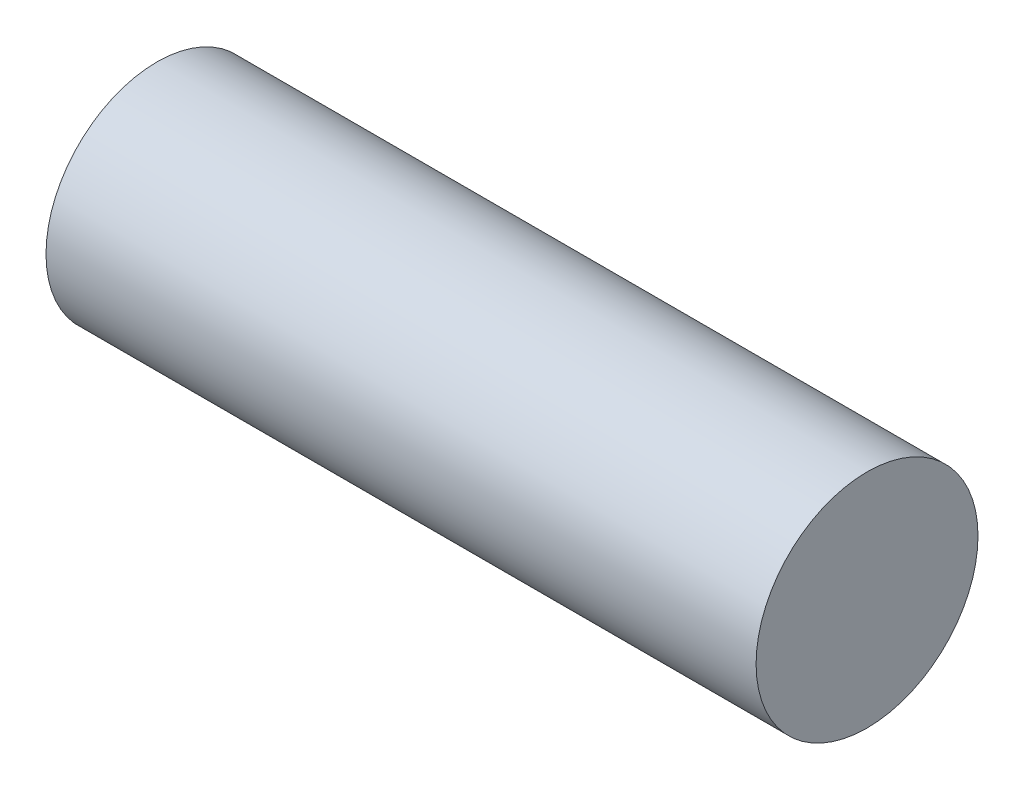
ISO-10303-21;
HEADER;
FILE_DESCRIPTION(('STEP AP214'),'2;1');
FILE_NAME('part.step','',(''),(''),'','','');
FILE_SCHEMA(('AUTOMOTIVE_DESIGN { 1 0 10303 214 1 1 1 1 }'));
ENDSEC;
DATA;
#1=APPLICATION_CONTEXT('core data for automotive mechanical design processes');
#2=APPLICATION_PROTOCOL_DEFINITION('international standard','automotive_design',2000,#1);
#3=PRODUCT_CONTEXT('',#1,'mechanical');
#4=PRODUCT('Part','Part','',(#3));
#5=PRODUCT_RELATED_PRODUCT_CATEGORY('part','',(#4));
#6=PRODUCT_DEFINITION_FORMATION('','',#4);
#7=PRODUCT_DEFINITION_CONTEXT('part definition',#1,'design');
#8=PRODUCT_DEFINITION('design','',#6,#7);
#9=PRODUCT_DEFINITION_SHAPE('','',#8);
#10=(LENGTH_UNIT() NAMED_UNIT(*) SI_UNIT(.MILLI.,.METRE.));
#11=(NAMED_UNIT(*) PLANE_ANGLE_UNIT() SI_UNIT($,.RADIAN.));
#12=(NAMED_UNIT(*) SI_UNIT($,.STERADIAN.) SOLID_ANGLE_UNIT());
#13=UNCERTAINTY_MEASURE_WITH_UNIT(LENGTH_MEASURE(1.E-05),#10,'distance_accuracy_value','');
#14=(GEOMETRIC_REPRESENTATION_CONTEXT(3) GLOBAL_UNCERTAINTY_ASSIGNED_CONTEXT((#13)) GLOBAL_UNIT_ASSIGNED_CONTEXT((#10,
#11,#12)) REPRESENTATION_CONTEXT('',''));
#15=CARTESIAN_POINT('',(0.,0.,0.));
#16=DIRECTION('',(0.,0.,1.));
#17=DIRECTION('',(1.,0.,0.));
#18=AXIS2_PLACEMENT_3D('',#15,#16,#17);
#19=CARTESIAN_POINT('',(16.,0.,0.));
#20=DIRECTION('',(-1.,0.,0.));
#21=DIRECTION('',(0.,0.,1.));
#22=AXIS2_PLACEMENT_3D('',#19,#20,#21);
#23=CYLINDRICAL_SURFACE('',#22,2.5);
#24=CARTESIAN_POINT('',(16.,0.,0.));
#25=DIRECTION('',(1.,0.,0.));
#26=DIRECTION('',(0.,0.,-1.));
#27=AXIS2_PLACEMENT_3D('',#24,#25,#26);
#28=CIRCLE('',#27,2.5);
#29=CARTESIAN_POINT('',(16.,0.,-2.5));
#30=VERTEX_POINT('',#29);
#31=EDGE_CURVE('E10',#30,#30,#28,.T.);
#32=ORIENTED_EDGE('',*,*,#31,.F.);
#33=EDGE_LOOP('',(#32));
#34=FACE_BOUND('',#33,.T.);
#35=CARTESIAN_POINT('',(0.,0.,0.));
#36=DIRECTION('',(1.,0.,0.));
#37=DIRECTION('',(0.,0.,-1.));
#38=AXIS2_PLACEMENT_3D('',#35,#36,#37);
#39=CIRCLE('',#38,2.5);
#40=CARTESIAN_POINT('',(0.,0.,-2.5));
#41=VERTEX_POINT('',#40);
#42=EDGE_CURVE('E40',#41,#41,#39,.T.);
#43=ORIENTED_EDGE('',*,*,#42,.T.);
#44=EDGE_LOOP('',(#43));
#45=FACE_BOUND('',#44,.T.);
#46=ADVANCED_FACE('F37',(#34,#45),#23,.T.);
#47=CARTESIAN_POINT('',(16.,0.,0.));
#48=DIRECTION('',(1.,0.,0.));
#49=DIRECTION('',(0.,0.,-1.));
#50=AXIS2_PLACEMENT_3D('',#47,#48,#49);
#51=PLANE('',#50);
#52=ORIENTED_EDGE('',*,*,#31,.T.);
#53=EDGE_LOOP('',(#52));
#54=FACE_BOUND('',#53,.T.);
#55=ADVANCED_FACE('F52',(#54),#51,.T.);
#56=CARTESIAN_POINT('',(0.,0.,0.));
#57=DIRECTION('',(1.,0.,0.));
#58=DIRECTION('',(0.,0.,-1.));
#59=AXIS2_PLACEMENT_3D('',#56,#57,#58);
#60=PLANE('',#59);
#61=ORIENTED_EDGE('',*,*,#42,.F.);
#62=EDGE_LOOP('',(#61));
#63=FACE_BOUND('',#62,.T.);
#64=ADVANCED_FACE('F50',(#63),#60,.F.);
#65=CLOSED_SHELL('',(#46,#55,#64));
#66=MANIFOLD_SOLID_BREP('B2',#65);
#67=ADVANCED_BREP_SHAPE_REPRESENTATION('',(#18,#66),#14);
#68=SHAPE_DEFINITION_REPRESENTATION(#9,#67);
ENDSEC;
END-ISO-10303-21;
